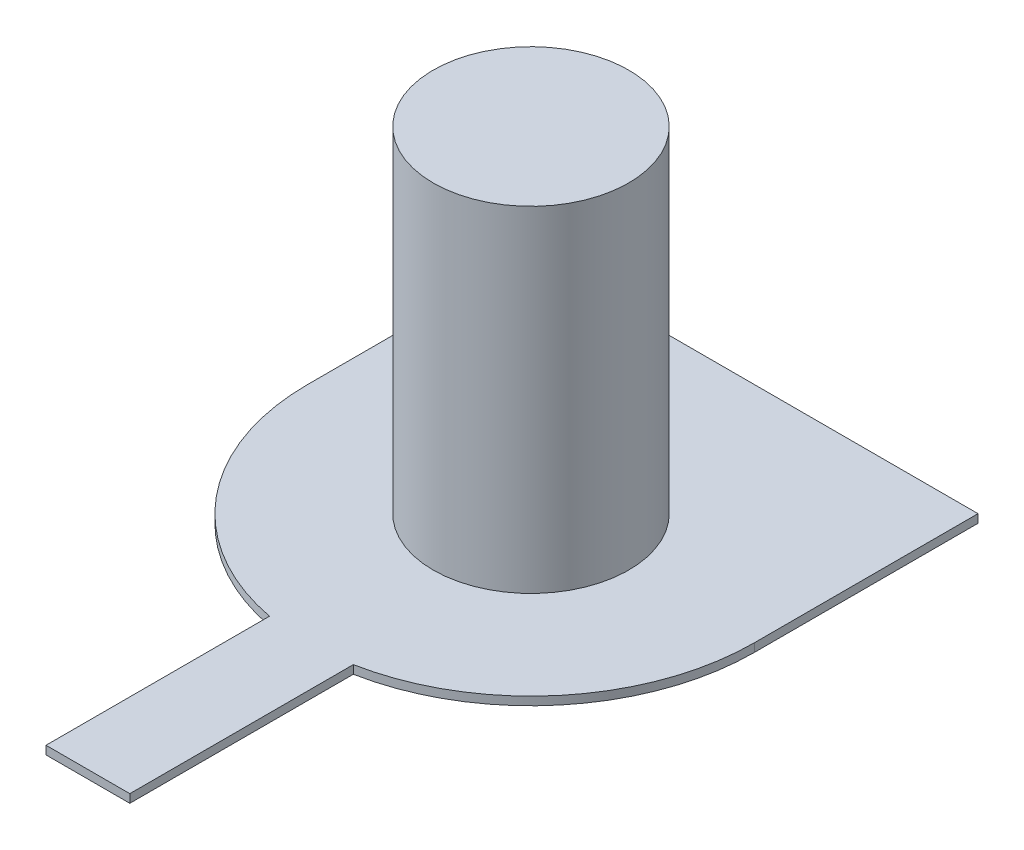
ISO-10303-21;
HEADER;
FILE_DESCRIPTION(('STEP AP214'),'2;1');
FILE_NAME('part.step','',(''),(''),'','','');
FILE_SCHEMA(('AUTOMOTIVE_DESIGN { 1 0 10303 214 1 1 1 1 }'));
ENDSEC;
DATA;
#1=APPLICATION_CONTEXT('core data for automotive mechanical design processes');
#2=APPLICATION_PROTOCOL_DEFINITION('international standard','automotive_design',2000,#1);
#3=PRODUCT_CONTEXT('',#1,'mechanical');
#4=PRODUCT('Part','Part','',(#3));
#5=PRODUCT_RELATED_PRODUCT_CATEGORY('part','',(#4));
#6=PRODUCT_DEFINITION_FORMATION('','',#4);
#7=PRODUCT_DEFINITION_CONTEXT('part definition',#1,'design');
#8=PRODUCT_DEFINITION('design','',#6,#7);
#9=PRODUCT_DEFINITION_SHAPE('','',#8);
#10=(LENGTH_UNIT() NAMED_UNIT(*) SI_UNIT(.MILLI.,.METRE.));
#11=(NAMED_UNIT(*) PLANE_ANGLE_UNIT() SI_UNIT($,.RADIAN.));
#12=(NAMED_UNIT(*) SI_UNIT($,.STERADIAN.) SOLID_ANGLE_UNIT());
#13=UNCERTAINTY_MEASURE_WITH_UNIT(LENGTH_MEASURE(1.E-05),#10,'distance_accuracy_value','');
#14=(GEOMETRIC_REPRESENTATION_CONTEXT(3) GLOBAL_UNCERTAINTY_ASSIGNED_CONTEXT((#13)) GLOBAL_UNIT_ASSIGNED_CONTEXT((#10,
#11,#12)) REPRESENTATION_CONTEXT('',''));
#15=CARTESIAN_POINT('',(0.,0.,0.));
#16=DIRECTION('',(0.,0.,1.));
#17=DIRECTION('',(1.,0.,0.));
#18=AXIS2_PLACEMENT_3D('',#15,#16,#17);
#19=CARTESIAN_POINT('',(0.,0.3,0.));
#20=DIRECTION('',(0.,-1.,0.));
#21=DIRECTION('',(0.,0.,-1.));
#22=AXIS2_PLACEMENT_3D('',#19,#20,#21);
#23=CYLINDRICAL_SURFACE('',#22,8.);
#24=CARTESIAN_POINT('',(0.,0.,0.));
#25=DIRECTION('',(0.,1.,0.));
#26=DIRECTION('',(0.,0.,1.));
#27=AXIS2_PLACEMENT_3D('',#24,#25,#26);
#28=CIRCLE('',#27,8.);
#29=CARTESIAN_POINT('',(-8.,0.,0.));
#30=VERTEX_POINT('',#29);
#31=CARTESIAN_POINT('',(-1.5,0.,7.85811682275086));
#32=VERTEX_POINT('',#31);
#33=EDGE_CURVE('E137',#30,#32,#28,.T.);
#34=ORIENTED_EDGE('',*,*,#33,.T.);
#35=DIRECTION('',(0.,-1.,0.));
#36=VECTOR('',#35,1.);
#37=CARTESIAN_POINT('',(-1.5,0.3,7.85811682275086));
#38=LINE('',#37,#36);
#39=CARTESIAN_POINT('',(-1.5,0.3,7.85811682275086));
#40=VERTEX_POINT('',#39);
#41=EDGE_CURVE('E42',#40,#32,#38,.T.);
#42=ORIENTED_EDGE('',*,*,#41,.F.);
#43=CARTESIAN_POINT('',(0.,0.3,0.));
#44=DIRECTION('',(0.,1.,0.));
#45=DIRECTION('',(0.,0.,1.));
#46=AXIS2_PLACEMENT_3D('',#43,#44,#45);
#47=CIRCLE('',#46,8.);
#48=CARTESIAN_POINT('',(-8.,0.3,0.));
#49=VERTEX_POINT('',#48);
#50=EDGE_CURVE('E152',#49,#40,#47,.T.);
#51=ORIENTED_EDGE('',*,*,#50,.F.);
#52=DIRECTION('',(0.,-1.,0.));
#53=VECTOR('',#52,1.);
#54=CARTESIAN_POINT('',(-8.,0.3,0.));
#55=LINE('',#54,#53);
#56=EDGE_CURVE('E133',#49,#30,#55,.T.);
#57=ORIENTED_EDGE('',*,*,#56,.T.);
#58=EDGE_LOOP('',(#34,#42,#51,#57));
#59=FACE_BOUND('',#58,.T.);
#60=ADVANCED_FACE('F39',(#59),#23,.T.);
#61=CARTESIAN_POINT('',(-1.5,0.3,7.85811682275086));
#62=DIRECTION('',(1.,0.,0.));
#63=DIRECTION('',(0.,0.,-1.));
#64=AXIS2_PLACEMENT_3D('',#61,#62,#63);
#65=PLANE('',#64);
#66=DIRECTION('',(0.,0.,1.));
#67=VECTOR('',#66,1.);
#68=CARTESIAN_POINT('',(-1.5,0.,7.85811682275086));
#69=LINE('',#68,#67);
#70=CARTESIAN_POINT('',(-1.5,0.,15.8581168227509));
#71=VERTEX_POINT('',#70);
#72=EDGE_CURVE('E140',#32,#71,#69,.T.);
#73=ORIENTED_EDGE('',*,*,#72,.T.);
#74=DIRECTION('',(0.,-1.,0.));
#75=VECTOR('',#74,1.);
#76=CARTESIAN_POINT('',(-1.5,0.3,15.8581168227509));
#77=LINE('',#76,#75);
#78=CARTESIAN_POINT('',(-1.5,0.3,15.8581168227509));
#79=VERTEX_POINT('',#78);
#80=EDGE_CURVE('E161',#79,#71,#77,.T.);
#81=ORIENTED_EDGE('',*,*,#80,.F.);
#82=DIRECTION('',(0.,0.,1.));
#83=VECTOR('',#82,1.);
#84=CARTESIAN_POINT('',(-1.5,0.3,7.85811682275086));
#85=LINE('',#84,#83);
#86=EDGE_CURVE('E100',#40,#79,#85,.T.);
#87=ORIENTED_EDGE('',*,*,#86,.F.);
#88=ORIENTED_EDGE('',*,*,#41,.T.);
#89=EDGE_LOOP('',(#73,#81,#87,#88));
#90=FACE_BOUND('',#89,.T.);
#91=ADVANCED_FACE('F167',(#90),#65,.F.);
#92=CARTESIAN_POINT('',(-1.5,0.3,15.8581168227509));
#93=DIRECTION('',(0.,0.,-1.));
#94=DIRECTION('',(-1.,0.,0.));
#95=AXIS2_PLACEMENT_3D('',#92,#93,#94);
#96=PLANE('',#95);
#97=DIRECTION('',(1.,0.,0.));
#98=VECTOR('',#97,1.);
#99=CARTESIAN_POINT('',(-1.5,0.,15.8581168227509));
#100=LINE('',#99,#98);
#101=CARTESIAN_POINT('',(1.5,0.,15.8581168227509));
#102=VERTEX_POINT('',#101);
#103=EDGE_CURVE('E143',#71,#102,#100,.T.);
#104=ORIENTED_EDGE('',*,*,#103,.T.);
#105=DIRECTION('',(0.,-1.,0.));
#106=VECTOR('',#105,1.);
#107=CARTESIAN_POINT('',(1.5,0.3,15.8581168227509));
#108=LINE('',#107,#106);
#109=CARTESIAN_POINT('',(1.5,0.3,15.8581168227509));
#110=VERTEX_POINT('',#109);
#111=EDGE_CURVE('E159',#110,#102,#108,.T.);
#112=ORIENTED_EDGE('',*,*,#111,.F.);
#113=DIRECTION('',(1.,0.,0.));
#114=VECTOR('',#113,1.);
#115=CARTESIAN_POINT('',(-1.5,0.3,15.8581168227509));
#116=LINE('',#115,#114);
#117=EDGE_CURVE('E182',#79,#110,#116,.T.);
#118=ORIENTED_EDGE('',*,*,#117,.F.);
#119=ORIENTED_EDGE('',*,*,#80,.T.);
#120=EDGE_LOOP('',(#104,#112,#118,#119));
#121=FACE_BOUND('',#120,.T.);
#122=ADVANCED_FACE('F176',(#121),#96,.F.);
#123=CARTESIAN_POINT('',(1.5,0.3,7.85811682275086));
#124=DIRECTION('',(-1.,0.,0.));
#125=DIRECTION('',(0.,0.,1.));
#126=AXIS2_PLACEMENT_3D('',#123,#124,#125);
#127=PLANE('',#126);
#128=DIRECTION('',(0.,0.,-1.));
#129=VECTOR('',#128,1.);
#130=CARTESIAN_POINT('',(1.5,0.,7.85811682275086));
#131=LINE('',#130,#129);
#132=CARTESIAN_POINT('',(1.5,0.,7.85811682275086));
#133=VERTEX_POINT('',#132);
#134=EDGE_CURVE('E145',#102,#133,#131,.T.);
#135=ORIENTED_EDGE('',*,*,#134,.T.);
#136=DIRECTION('',(0.,-1.,0.));
#137=VECTOR('',#136,1.);
#138=CARTESIAN_POINT('',(1.5,0.3,7.85811682275086));
#139=LINE('',#138,#137);
#140=CARTESIAN_POINT('',(1.5,0.3,7.85811682275086));
#141=VERTEX_POINT('',#140);
#142=EDGE_CURVE('E156',#141,#133,#139,.T.);
#143=ORIENTED_EDGE('',*,*,#142,.F.);
#144=DIRECTION('',(0.,0.,-1.));
#145=VECTOR('',#144,1.);
#146=CARTESIAN_POINT('',(1.5,0.3,7.85811682275086));
#147=LINE('',#146,#145);
#148=EDGE_CURVE('E181',#110,#141,#147,.T.);
#149=ORIENTED_EDGE('',*,*,#148,.F.);
#150=ORIENTED_EDGE('',*,*,#111,.T.);
#151=EDGE_LOOP('',(#135,#143,#149,#150));
#152=FACE_BOUND('',#151,.T.);
#153=ADVANCED_FACE('F179',(#152),#127,.F.);
#154=CARTESIAN_POINT('',(0.,0.3,0.));
#155=DIRECTION('',(0.,-1.,0.));
#156=DIRECTION('',(0.,0.,-1.));
#157=AXIS2_PLACEMENT_3D('',#154,#155,#156);
#158=CYLINDRICAL_SURFACE('',#157,8.);
#159=CARTESIAN_POINT('',(0.,0.,0.));
#160=DIRECTION('',(0.,1.,0.));
#161=DIRECTION('',(0.,0.,1.));
#162=AXIS2_PLACEMENT_3D('',#159,#160,#161);
#163=CIRCLE('',#162,8.);
#164=CARTESIAN_POINT('',(8.,0.,0.));
#165=VERTEX_POINT('',#164);
#166=EDGE_CURVE('E147',#133,#165,#163,.T.);
#167=ORIENTED_EDGE('',*,*,#166,.T.);
#168=DIRECTION('',(0.,-1.,0.));
#169=VECTOR('',#168,1.);
#170=CARTESIAN_POINT('',(8.,0.3,0.));
#171=LINE('',#170,#169);
#172=CARTESIAN_POINT('',(8.,0.3,0.));
#173=VERTEX_POINT('',#172);
#174=EDGE_CURVE('E128',#173,#165,#171,.T.);
#175=ORIENTED_EDGE('',*,*,#174,.F.);
#176=CARTESIAN_POINT('',(0.,0.3,0.));
#177=DIRECTION('',(0.,1.,0.));
#178=DIRECTION('',(0.,0.,1.));
#179=AXIS2_PLACEMENT_3D('',#176,#177,#178);
#180=CIRCLE('',#179,8.);
#181=EDGE_CURVE('E119',#141,#173,#180,.T.);
#182=ORIENTED_EDGE('',*,*,#181,.F.);
#183=ORIENTED_EDGE('',*,*,#142,.T.);
#184=EDGE_LOOP('',(#167,#175,#182,#183));
#185=FACE_BOUND('',#184,.T.);
#186=ADVANCED_FACE('F219',(#185),#158,.T.);
#187=CARTESIAN_POINT('',(8.,0.3,-8.));
#188=DIRECTION('',(-1.,0.,0.));
#189=DIRECTION('',(0.,0.,1.));
#190=AXIS2_PLACEMENT_3D('',#187,#188,#189);
#191=PLANE('',#190);
#192=DIRECTION('',(0.,0.,-1.));
#193=VECTOR('',#192,1.);
#194=CARTESIAN_POINT('',(8.,0.,-8.));
#195=LINE('',#194,#193);
#196=CARTESIAN_POINT('',(8.,0.,-8.));
#197=VERTEX_POINT('',#196);
#198=EDGE_CURVE('E127',#165,#197,#195,.T.);
#199=ORIENTED_EDGE('',*,*,#198,.T.);
#200=DIRECTION('',(0.,-1.,0.));
#201=VECTOR('',#200,1.);
#202=CARTESIAN_POINT('',(8.,0.3,-8.));
#203=LINE('',#202,#201);
#204=CARTESIAN_POINT('',(8.,0.3,-8.));
#205=VERTEX_POINT('',#204);
#206=EDGE_CURVE('E124',#205,#197,#203,.T.);
#207=ORIENTED_EDGE('',*,*,#206,.F.);
#208=DIRECTION('',(0.,0.,-1.));
#209=VECTOR('',#208,1.);
#210=CARTESIAN_POINT('',(8.,0.3,-8.));
#211=LINE('',#210,#209);
#212=EDGE_CURVE('E113',#173,#205,#211,.T.);
#213=ORIENTED_EDGE('',*,*,#212,.F.);
#214=ORIENTED_EDGE('',*,*,#174,.T.);
#215=EDGE_LOOP('',(#199,#207,#213,#214));
#216=FACE_BOUND('',#215,.T.);
#217=ADVANCED_FACE('F125',(#216),#191,.F.);
#218=CARTESIAN_POINT('',(-8.,0.3,-8.));
#219=DIRECTION('',(0.,0.,1.));
#220=DIRECTION('',(1.,0.,0.));
#221=AXIS2_PLACEMENT_3D('',#218,#219,#220);
#222=PLANE('',#221);
#223=DIRECTION('',(-1.,0.,0.));
#224=VECTOR('',#223,1.);
#225=CARTESIAN_POINT('',(-8.,0.,-8.));
#226=LINE('',#225,#224);
#227=CARTESIAN_POINT('',(-8.,0.,-8.));
#228=VERTEX_POINT('',#227);
#229=EDGE_CURVE('E85',#197,#228,#226,.T.);
#230=ORIENTED_EDGE('',*,*,#229,.T.);
#231=DIRECTION('',(0.,-1.,0.));
#232=VECTOR('',#231,1.);
#233=CARTESIAN_POINT('',(-8.,0.3,-8.));
#234=LINE('',#233,#232);
#235=CARTESIAN_POINT('',(-8.,0.3,-8.));
#236=VERTEX_POINT('',#235);
#237=EDGE_CURVE('E129',#236,#228,#234,.T.);
#238=ORIENTED_EDGE('',*,*,#237,.F.);
#239=DIRECTION('',(-1.,0.,0.));
#240=VECTOR('',#239,1.);
#241=CARTESIAN_POINT('',(-8.,0.3,-8.));
#242=LINE('',#241,#240);
#243=EDGE_CURVE('E117',#205,#236,#242,.T.);
#244=ORIENTED_EDGE('',*,*,#243,.F.);
#245=ORIENTED_EDGE('',*,*,#206,.T.);
#246=EDGE_LOOP('',(#230,#238,#244,#245));
#247=FACE_BOUND('',#246,.T.);
#248=ADVANCED_FACE('F131',(#247),#222,.F.);
#249=CARTESIAN_POINT('',(-8.,0.3,0.));
#250=DIRECTION('',(1.,0.,0.));
#251=DIRECTION('',(0.,0.,-1.));
#252=AXIS2_PLACEMENT_3D('',#249,#250,#251);
#253=PLANE('',#252);
#254=DIRECTION('',(0.,0.,1.));
#255=VECTOR('',#254,1.);
#256=CARTESIAN_POINT('',(-8.,0.,0.));
#257=LINE('',#256,#255);
#258=EDGE_CURVE('E91',#228,#30,#257,.T.);
#259=ORIENTED_EDGE('',*,*,#258,.T.);
#260=ORIENTED_EDGE('',*,*,#56,.F.);
#261=DIRECTION('',(0.,0.,1.));
#262=VECTOR('',#261,1.);
#263=CARTESIAN_POINT('',(-8.,0.3,0.));
#264=LINE('',#263,#262);
#265=EDGE_CURVE('E56',#236,#49,#264,.T.);
#266=ORIENTED_EDGE('',*,*,#265,.F.);
#267=ORIENTED_EDGE('',*,*,#237,.T.);
#268=EDGE_LOOP('',(#259,#260,#266,#267));
#269=FACE_BOUND('',#268,.T.);
#270=ADVANCED_FACE('F200',(#269),#253,.F.);
#271=CARTESIAN_POINT('',(0.,0.3,0.));
#272=DIRECTION('',(0.,1.,0.));
#273=DIRECTION('',(0.,0.,1.));
#274=AXIS2_PLACEMENT_3D('',#271,#272,#273);
#275=PLANE('',#274);
#276=CARTESIAN_POINT('',(0.,0.3,0.));
#277=DIRECTION('',(0.,1.,0.));
#278=DIRECTION('',(0.,0.,1.));
#279=AXIS2_PLACEMENT_3D('',#276,#277,#278);
#280=CIRCLE('',#279,3.5);
#281=CARTESIAN_POINT('',(0.,0.3,3.5));
#282=VERTEX_POINT('',#281);
#283=EDGE_CURVE('E11',#282,#282,#280,.T.);
#284=ORIENTED_EDGE('',*,*,#283,.F.);
#285=EDGE_LOOP('',(#284));
#286=FACE_BOUND('',#285,.T.);
#287=ORIENTED_EDGE('',*,*,#50,.T.);
#288=ORIENTED_EDGE('',*,*,#86,.T.);
#289=ORIENTED_EDGE('',*,*,#117,.T.);
#290=ORIENTED_EDGE('',*,*,#148,.T.);
#291=ORIENTED_EDGE('',*,*,#181,.T.);
#292=ORIENTED_EDGE('',*,*,#212,.T.);
#293=ORIENTED_EDGE('',*,*,#243,.T.);
#294=ORIENTED_EDGE('',*,*,#265,.T.);
#295=EDGE_LOOP('',(#287,#288,#289,#290,#291,#292,#293,#294));
#296=FACE_BOUND('',#295,.T.);
#297=ADVANCED_FACE('F115',(#286,#296),#275,.T.);
#298=CARTESIAN_POINT('',(0.,0.,0.));
#299=DIRECTION('',(0.,1.,0.));
#300=DIRECTION('',(0.,0.,1.));
#301=AXIS2_PLACEMENT_3D('',#298,#299,#300);
#302=PLANE('',#301);
#303=ORIENTED_EDGE('',*,*,#33,.F.);
#304=ORIENTED_EDGE('',*,*,#258,.F.);
#305=ORIENTED_EDGE('',*,*,#229,.F.);
#306=ORIENTED_EDGE('',*,*,#198,.F.);
#307=ORIENTED_EDGE('',*,*,#166,.F.);
#308=ORIENTED_EDGE('',*,*,#134,.F.);
#309=ORIENTED_EDGE('',*,*,#103,.F.);
#310=ORIENTED_EDGE('',*,*,#72,.F.);
#311=EDGE_LOOP('',(#303,#304,#305,#306,#307,#308,#309,#310));
#312=FACE_BOUND('',#311,.T.);
#313=ADVANCED_FACE('F172',(#312),#302,.F.);
#314=CARTESIAN_POINT('',(0.,12.3,0.));
#315=DIRECTION('',(0.,-1.,0.));
#316=DIRECTION('',(0.,0.,-1.));
#317=AXIS2_PLACEMENT_3D('',#314,#315,#316);
#318=CYLINDRICAL_SURFACE('',#317,3.5);
#319=CARTESIAN_POINT('',(0.,12.3,0.));
#320=DIRECTION('',(0.,1.,0.));
#321=DIRECTION('',(0.,0.,1.));
#322=AXIS2_PLACEMENT_3D('',#319,#320,#321);
#323=CIRCLE('',#322,3.5);
#324=CARTESIAN_POINT('',(0.,12.3,3.5));
#325=VERTEX_POINT('',#324);
#326=EDGE_CURVE('E141',#325,#325,#323,.T.);
#327=ORIENTED_EDGE('',*,*,#326,.F.);
#328=EDGE_LOOP('',(#327));
#329=FACE_BOUND('',#328,.T.);
#330=ORIENTED_EDGE('',*,*,#283,.T.);
#331=EDGE_LOOP('',(#330));
#332=FACE_BOUND('',#331,.T.);
#333=ADVANCED_FACE('F193',(#329,#332),#318,.T.);
#334=CARTESIAN_POINT('',(0.,12.3,0.));
#335=DIRECTION('',(0.,1.,0.));
#336=DIRECTION('',(0.,0.,1.));
#337=AXIS2_PLACEMENT_3D('',#334,#335,#336);
#338=PLANE('',#337);
#339=ORIENTED_EDGE('',*,*,#326,.T.);
#340=EDGE_LOOP('',(#339));
#341=FACE_BOUND('',#340,.T.);
#342=ADVANCED_FACE('F191',(#341),#338,.T.);
#343=CLOSED_SHELL('',(#60,#91,#122,#153,#186,#217,#248,#270,#297,#313,#333,#342));
#344=MANIFOLD_SOLID_BREP('B2',#343);
#345=ADVANCED_BREP_SHAPE_REPRESENTATION('',(#18,#344),#14);
#346=SHAPE_DEFINITION_REPRESENTATION(#9,#345);
ENDSEC;
END-ISO-10303-21;
